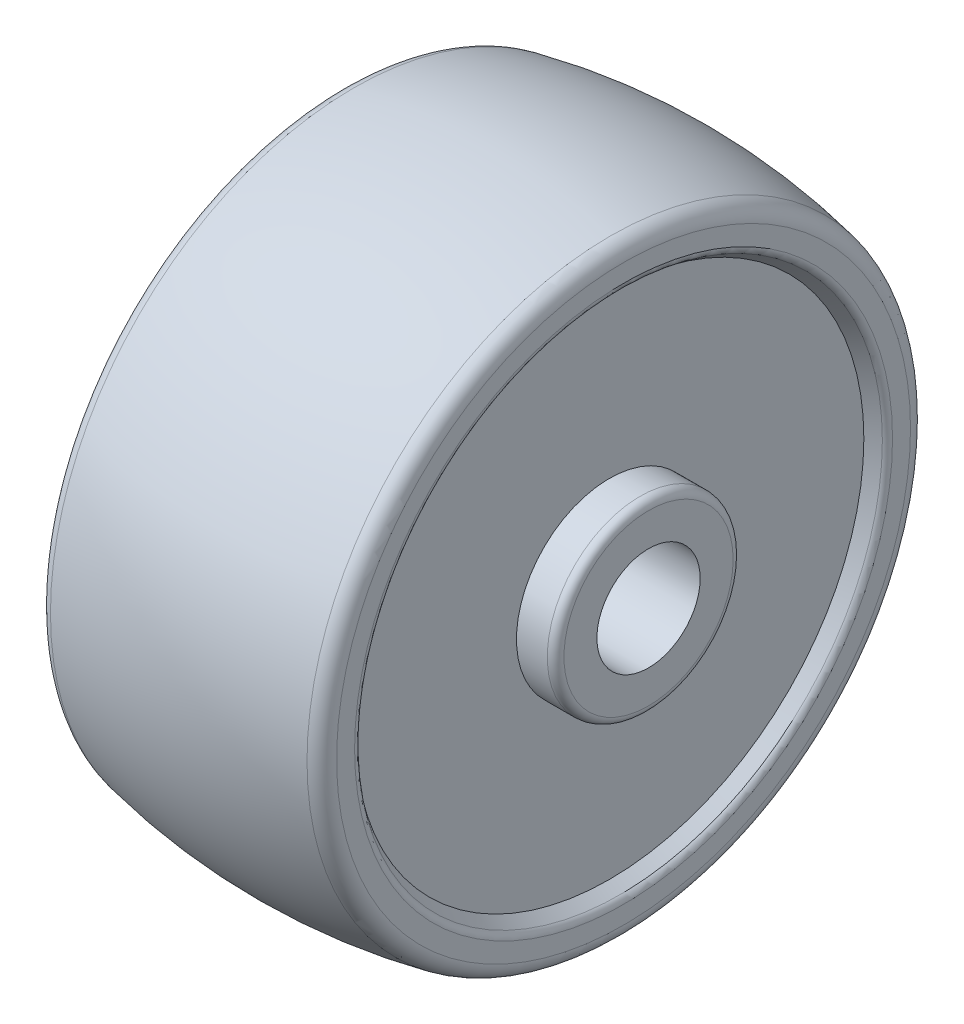
ISO-10303-21;
HEADER;
FILE_DESCRIPTION(('STEP AP214'),'2;1');
FILE_NAME('part.step','',(''),(''),'','','');
FILE_SCHEMA(('AUTOMOTIVE_DESIGN { 1 0 10303 214 1 1 1 1 }'));
ENDSEC;
DATA;
#1=APPLICATION_CONTEXT('core data for automotive mechanical design processes');
#2=APPLICATION_PROTOCOL_DEFINITION('international standard','automotive_design',2000,#1);
#3=PRODUCT_CONTEXT('',#1,'mechanical');
#4=PRODUCT('Part','Part','',(#3));
#5=PRODUCT_RELATED_PRODUCT_CATEGORY('part','',(#4));
#6=PRODUCT_DEFINITION_FORMATION('','',#4);
#7=PRODUCT_DEFINITION_CONTEXT('part definition',#1,'design');
#8=PRODUCT_DEFINITION('design','',#6,#7);
#9=PRODUCT_DEFINITION_SHAPE('','',#8);
#10=(LENGTH_UNIT() NAMED_UNIT(*) SI_UNIT(.MILLI.,.METRE.));
#11=(NAMED_UNIT(*) PLANE_ANGLE_UNIT() SI_UNIT($,.RADIAN.));
#12=(NAMED_UNIT(*) SI_UNIT($,.STERADIAN.) SOLID_ANGLE_UNIT());
#13=UNCERTAINTY_MEASURE_WITH_UNIT(LENGTH_MEASURE(1.E-05),#10,'distance_accuracy_value','');
#14=(GEOMETRIC_REPRESENTATION_CONTEXT(3) GLOBAL_UNCERTAINTY_ASSIGNED_CONTEXT((#13)) GLOBAL_UNIT_ASSIGNED_CONTEXT((#10,
#11,#12)) REPRESENTATION_CONTEXT('',''));
#15=CARTESIAN_POINT('',(0.,0.,0.));
#16=DIRECTION('',(0.,0.,1.));
#17=DIRECTION('',(1.,0.,0.));
#18=AXIS2_PLACEMENT_3D('',#15,#16,#17);
#19=CARTESIAN_POINT('',(-9.5,0.,0.));
#20=DIRECTION('',(1.,0.,0.));
#21=DIRECTION('',(0.,0.,-1.));
#22=AXIS2_PLACEMENT_3D('',#19,#20,#21);
#23=TOROIDAL_SURFACE('',#22,5.08000000000009,0.499999999999912);
#24=CARTESIAN_POINT('',(-10.,0.,0.));
#25=DIRECTION('',(1.,0.,0.));
#26=DIRECTION('',(0.,0.,-1.));
#27=AXIS2_PLACEMENT_3D('',#24,#25,#26);
#28=CIRCLE('',#27,5.08000000000009);
#29=CARTESIAN_POINT('',(-10.,0.,-5.08000000000009));
#30=VERTEX_POINT('',#29);
#31=EDGE_CURVE('E73',#30,#30,#28,.T.);
#32=ORIENTED_EDGE('',*,*,#31,.T.);
#33=EDGE_LOOP('',(#32));
#34=FACE_BOUND('',#33,.T.);
#35=CARTESIAN_POINT('',(-9.5,0.,0.));
#36=DIRECTION('',(1.,0.,0.));
#37=DIRECTION('',(0.,0.,-1.));
#38=AXIS2_PLACEMENT_3D('',#35,#36,#37);
#39=CIRCLE('',#38,5.58);
#40=CARTESIAN_POINT('',(-9.5,0.,-5.58));
#41=VERTEX_POINT('',#40);
#42=EDGE_CURVE('E70',#41,#41,#39,.T.);
#43=ORIENTED_EDGE('',*,*,#42,.F.);
#44=EDGE_LOOP('',(#43));
#45=FACE_BOUND('',#44,.T.);
#46=ADVANCED_FACE('F14',(#34,#45),#23,.T.);
#47=CARTESIAN_POINT('',(-10.,5.08,0.));
#48=DIRECTION('',(-1.,0.,0.));
#49=DIRECTION('',(0.,0.,1.));
#50=AXIS2_PLACEMENT_3D('',#47,#48,#49);
#51=PLANE('',#50);
#52=CARTESIAN_POINT('',(-10.,0.,0.));
#53=DIRECTION('',(1.,0.,0.));
#54=DIRECTION('',(0.,0.,-1.));
#55=AXIS2_PLACEMENT_3D('',#52,#53,#54);
#56=CIRCLE('',#55,3.1);
#57=CARTESIAN_POINT('',(-10.,0.,-3.1));
#58=VERTEX_POINT('',#57);
#59=EDGE_CURVE('E67',#58,#58,#56,.T.);
#60=ORIENTED_EDGE('',*,*,#59,.T.);
#61=EDGE_LOOP('',(#60));
#62=FACE_BOUND('',#61,.T.);
#63=ORIENTED_EDGE('',*,*,#31,.F.);
#64=EDGE_LOOP('',(#63));
#65=FACE_BOUND('',#64,.T.);
#66=ADVANCED_FACE('F79',(#62,#65),#51,.T.);
#67=CARTESIAN_POINT('',(10.,0.,0.));
#68=DIRECTION('',(1.,0.,0.));
#69=DIRECTION('',(0.,0.,-1.));
#70=AXIS2_PLACEMENT_3D('',#67,#68,#69);
#71=CYLINDRICAL_SURFACE('',#70,5.58);
#72=ORIENTED_EDGE('',*,*,#42,.T.);
#73=EDGE_LOOP('',(#72));
#74=FACE_BOUND('',#73,.T.);
#75=CARTESIAN_POINT('',(-7.65,0.,0.));
#76=DIRECTION('',(1.,0.,0.));
#77=DIRECTION('',(0.,0.,-1.));
#78=AXIS2_PLACEMENT_3D('',#75,#76,#77);
#79=CIRCLE('',#78,5.58);
#80=CARTESIAN_POINT('',(-7.65,0.,-5.58));
#81=VERTEX_POINT('',#80);
#82=EDGE_CURVE('E64',#81,#81,#79,.T.);
#83=ORIENTED_EDGE('',*,*,#82,.F.);
#84=EDGE_LOOP('',(#83));
#85=FACE_BOUND('',#84,.T.);
#86=ADVANCED_FACE('F81',(#74,#85),#71,.T.);
#87=CARTESIAN_POINT('',(10.,0.,0.));
#88=DIRECTION('',(1.,0.,0.));
#89=DIRECTION('',(0.,0.,-1.));
#90=AXIS2_PLACEMENT_3D('',#87,#88,#89);
#91=CYLINDRICAL_SURFACE('',#90,3.1);
#92=CARTESIAN_POINT('',(10.,0.,0.));
#93=DIRECTION('',(1.,0.,0.));
#94=DIRECTION('',(0.,0.,-1.));
#95=AXIS2_PLACEMENT_3D('',#92,#93,#94);
#96=CIRCLE('',#95,3.1);
#97=CARTESIAN_POINT('',(10.,0.,-3.1));
#98=VERTEX_POINT('',#97);
#99=EDGE_CURVE('E61',#98,#98,#96,.T.);
#100=ORIENTED_EDGE('',*,*,#99,.T.);
#101=EDGE_LOOP('',(#100));
#102=FACE_BOUND('',#101,.T.);
#103=ORIENTED_EDGE('',*,*,#59,.F.);
#104=EDGE_LOOP('',(#103));
#105=FACE_BOUND('',#104,.T.);
#106=ADVANCED_FACE('F89',(#102,#105),#91,.F.);
#107=CARTESIAN_POINT('',(-7.65,15.28,0.));
#108=DIRECTION('',(-1.,0.,0.));
#109=DIRECTION('',(0.,0.,1.));
#110=AXIS2_PLACEMENT_3D('',#107,#108,#109);
#111=PLANE('',#110);
#112=ORIENTED_EDGE('',*,*,#82,.T.);
#113=EDGE_LOOP('',(#112));
#114=FACE_BOUND('',#113,.T.);
#115=CARTESIAN_POINT('',(-7.65,0.,0.));
#116=DIRECTION('',(1.,0.,0.));
#117=DIRECTION('',(0.,0.,-1.));
#118=AXIS2_PLACEMENT_3D('',#115,#116,#117);
#119=CIRCLE('',#118,15.28);
#120=CARTESIAN_POINT('',(-7.65,0.,-15.28));
#121=VERTEX_POINT('',#120);
#122=EDGE_CURVE('E58',#121,#121,#119,.T.);
#123=ORIENTED_EDGE('',*,*,#122,.F.);
#124=EDGE_LOOP('',(#123));
#125=FACE_BOUND('',#124,.T.);
#126=ADVANCED_FACE('F96',(#114,#125),#111,.T.);
#127=CARTESIAN_POINT('',(10.,3.1,0.));
#128=DIRECTION('',(1.,0.,0.));
#129=DIRECTION('',(0.,0.,-1.));
#130=AXIS2_PLACEMENT_3D('',#127,#128,#129);
#131=PLANE('',#130);
#132=CARTESIAN_POINT('',(10.,0.,0.));
#133=DIRECTION('',(1.,0.,0.));
#134=DIRECTION('',(0.,0.,-1.));
#135=AXIS2_PLACEMENT_3D('',#132,#133,#134);
#136=CIRCLE('',#135,5.08000000000009);
#137=CARTESIAN_POINT('',(10.,0.,-5.08000000000009));
#138=VERTEX_POINT('',#137);
#139=EDGE_CURVE('E55',#138,#138,#136,.T.);
#140=ORIENTED_EDGE('',*,*,#139,.T.);
#141=EDGE_LOOP('',(#140));
#142=FACE_BOUND('',#141,.T.);
#143=ORIENTED_EDGE('',*,*,#99,.F.);
#144=EDGE_LOOP('',(#143));
#145=FACE_BOUND('',#144,.T.);
#146=ADVANCED_FACE('F100',(#142,#145),#131,.T.);
#147=CARTESIAN_POINT('',(-8.2938926261462,0.,0.));
#148=DIRECTION('',(-1.,0.,0.));
#149=DIRECTION('',(0.,0.,1.));
#150=AXIS2_PLACEMENT_3D('',#147,#148,#149);
#151=CONICAL_SURFACE('',#150,15.747815376364,0.628318530717684);
#152=ORIENTED_EDGE('',*,*,#122,.T.);
#153=EDGE_LOOP('',(#152));
#154=FACE_BOUND('',#153,.T.);
#155=CARTESIAN_POINT('',(-8.2938926261462,0.,0.));
#156=DIRECTION('',(1.,0.,0.));
#157=DIRECTION('',(0.,0.,-1.));
#158=AXIS2_PLACEMENT_3D('',#155,#156,#157);
#159=CIRCLE('',#158,15.747815376364);
#160=CARTESIAN_POINT('',(-8.2938926261462,0.,-15.747815376364));
#161=VERTEX_POINT('',#160);
#162=EDGE_CURVE('E52',#161,#161,#159,.T.);
#163=ORIENTED_EDGE('',*,*,#162,.F.);
#164=EDGE_LOOP('',(#163));
#165=FACE_BOUND('',#164,.T.);
#166=ADVANCED_FACE('F104',(#154,#165),#151,.F.);
#167=CARTESIAN_POINT('',(9.5,0.,0.));
#168=DIRECTION('',(1.,0.,0.));
#169=DIRECTION('',(0.,0.,-1.));
#170=AXIS2_PLACEMENT_3D('',#167,#168,#169);
#171=TOROIDAL_SURFACE('',#170,5.08000000000009,0.499999999999912);
#172=CARTESIAN_POINT('',(9.5,0.,0.));
#173=DIRECTION('',(1.,0.,0.));
#174=DIRECTION('',(0.,0.,-1.));
#175=AXIS2_PLACEMENT_3D('',#172,#173,#174);
#176=CIRCLE('',#175,5.58);
#177=CARTESIAN_POINT('',(9.5,0.,-5.58));
#178=VERTEX_POINT('',#177);
#179=EDGE_CURVE('E49',#178,#178,#176,.T.);
#180=ORIENTED_EDGE('',*,*,#179,.T.);
#181=EDGE_LOOP('',(#180));
#182=FACE_BOUND('',#181,.T.);
#183=ORIENTED_EDGE('',*,*,#139,.F.);
#184=EDGE_LOOP('',(#183));
#185=FACE_BOUND('',#184,.T.);
#186=ADVANCED_FACE('F108',(#182,#185),#171,.T.);
#187=CARTESIAN_POINT('',(-7.9999999999991,0.,0.));
#188=DIRECTION('',(1.,0.,0.));
#189=DIRECTION('',(0.,0.,-1.));
#190=AXIS2_PLACEMENT_3D('',#187,#188,#189);
#191=TOROIDAL_SURFACE('',#190,16.1523238735519,0.500000000000899);
#192=ORIENTED_EDGE('',*,*,#162,.T.);
#193=EDGE_LOOP('',(#192));
#194=FACE_BOUND('',#193,.T.);
#195=CARTESIAN_POINT('',(-8.5,0.,0.));
#196=DIRECTION('',(1.,0.,0.));
#197=DIRECTION('',(0.,0.,-1.));
#198=AXIS2_PLACEMENT_3D('',#195,#196,#197);
#199=CIRCLE('',#198,16.1523238735519);
#200=CARTESIAN_POINT('',(-8.5,0.,-16.1523238735519));
#201=VERTEX_POINT('',#200);
#202=EDGE_CURVE('E46',#201,#201,#199,.T.);
#203=ORIENTED_EDGE('',*,*,#202,.F.);
#204=EDGE_LOOP('',(#203));
#205=FACE_BOUND('',#204,.T.);
#206=ADVANCED_FACE('F112',(#194,#205),#191,.T.);
#207=CARTESIAN_POINT('',(10.,0.,0.));
#208=DIRECTION('',(1.,0.,0.));
#209=DIRECTION('',(0.,0.,-1.));
#210=AXIS2_PLACEMENT_3D('',#207,#208,#209);
#211=CYLINDRICAL_SURFACE('',#210,5.58);
#212=CARTESIAN_POINT('',(7.65,0.,0.));
#213=DIRECTION('',(1.,0.,0.));
#214=DIRECTION('',(0.,0.,-1.));
#215=AXIS2_PLACEMENT_3D('',#212,#213,#214);
#216=CIRCLE('',#215,5.58);
#217=CARTESIAN_POINT('',(7.65,0.,-5.58));
#218=VERTEX_POINT('',#217);
#219=EDGE_CURVE('E43',#218,#218,#216,.T.);
#220=ORIENTED_EDGE('',*,*,#219,.T.);
#221=EDGE_LOOP('',(#220));
#222=FACE_BOUND('',#221,.T.);
#223=ORIENTED_EDGE('',*,*,#179,.F.);
#224=EDGE_LOOP('',(#223));
#225=FACE_BOUND('',#224,.T.);
#226=ADVANCED_FACE('F116',(#222,#225),#211,.T.);
#227=CARTESIAN_POINT('',(-8.5,17.231892028985,0.));
#228=DIRECTION('',(-1.,0.,0.));
#229=DIRECTION('',(0.,0.,1.));
#230=AXIS2_PLACEMENT_3D('',#227,#228,#229);
#231=PLANE('',#230);
#232=ORIENTED_EDGE('',*,*,#202,.T.);
#233=EDGE_LOOP('',(#232));
#234=FACE_BOUND('',#233,.T.);
#235=CARTESIAN_POINT('',(-8.5,0.,0.));
#236=DIRECTION('',(1.,0.,0.));
#237=DIRECTION('',(0.,0.,-1.));
#238=AXIS2_PLACEMENT_3D('',#235,#236,#237);
#239=CIRCLE('',#238,17.2318919408287);
#240=CARTESIAN_POINT('',(-8.5,0.,-17.2318919408287));
#241=VERTEX_POINT('',#240);
#242=EDGE_CURVE('E40',#241,#241,#239,.T.);
#243=ORIENTED_EDGE('',*,*,#242,.F.);
#244=EDGE_LOOP('',(#243));
#245=FACE_BOUND('',#244,.T.);
#246=ADVANCED_FACE('F120',(#234,#245),#231,.T.);
#247=CARTESIAN_POINT('',(7.65,5.58,0.));
#248=DIRECTION('',(1.,0.,0.));
#249=DIRECTION('',(0.,0.,-1.));
#250=AXIS2_PLACEMENT_3D('',#247,#248,#249);
#251=PLANE('',#250);
#252=CARTESIAN_POINT('',(7.65,0.,0.));
#253=DIRECTION('',(1.,0.,0.));
#254=DIRECTION('',(0.,0.,-1.));
#255=AXIS2_PLACEMENT_3D('',#252,#253,#254);
#256=CIRCLE('',#255,15.28);
#257=CARTESIAN_POINT('',(7.65,0.,-15.28));
#258=VERTEX_POINT('',#257);
#259=EDGE_CURVE('E37',#258,#258,#256,.T.);
#260=ORIENTED_EDGE('',*,*,#259,.T.);
#261=EDGE_LOOP('',(#260));
#262=FACE_BOUND('',#261,.T.);
#263=ORIENTED_EDGE('',*,*,#219,.F.);
#264=EDGE_LOOP('',(#263));
#265=FACE_BOUND('',#264,.T.);
#266=ADVANCED_FACE('F124',(#262,#265),#251,.T.);
#267=CARTESIAN_POINT('',(-7.50000000000109,0.,0.));
#268=DIRECTION('',(1.,0.,0.));
#269=DIRECTION('',(0.,0.,-1.));
#270=AXIS2_PLACEMENT_3D('',#267,#268,#269);
#271=TOROIDAL_SURFACE('',#270,17.2318920289852,0.999999999998914);
#272=ORIENTED_EDGE('',*,*,#242,.T.);
#273=EDGE_LOOP('',(#272));
#274=FACE_BOUND('',#273,.T.);
#275=CARTESIAN_POINT('',(-7.7027027027027,0.,0.));
#276=DIRECTION('',(1.,0.,0.));
#277=DIRECTION('',(0.,0.,-1.));
#278=AXIS2_PLACEMENT_3D('',#275,#276,#277);
#279=CIRCLE('',#278,18.211132354092);
#280=CARTESIAN_POINT('',(-7.7027027027027,0.,-18.211132354092));
#281=VERTEX_POINT('',#280);
#282=EDGE_CURVE('E34',#281,#281,#279,.T.);
#283=ORIENTED_EDGE('',*,*,#282,.F.);
#284=EDGE_LOOP('',(#283));
#285=FACE_BOUND('',#284,.T.);
#286=ADVANCED_FACE('F128',(#274,#285),#271,.T.);
#287=CARTESIAN_POINT('',(7.65,0.,0.));
#288=DIRECTION('',(1.,0.,0.));
#289=DIRECTION('',(0.,0.,-1.));
#290=AXIS2_PLACEMENT_3D('',#287,#288,#289);
#291=CONICAL_SURFACE('',#290,15.28,0.628318530717684);
#292=CARTESIAN_POINT('',(8.2938926261462,0.,0.));
#293=DIRECTION('',(1.,0.,0.));
#294=DIRECTION('',(0.,0.,-1.));
#295=AXIS2_PLACEMENT_3D('',#292,#293,#294);
#296=CIRCLE('',#295,15.747815376364);
#297=CARTESIAN_POINT('',(8.2938926261462,0.,-15.747815376364));
#298=VERTEX_POINT('',#297);
#299=EDGE_CURVE('E29',#298,#298,#296,.T.);
#300=ORIENTED_EDGE('',*,*,#299,.T.);
#301=EDGE_LOOP('',(#300));
#302=FACE_BOUND('',#301,.T.);
#303=ORIENTED_EDGE('',*,*,#259,.F.);
#304=EDGE_LOOP('',(#303));
#305=FACE_BOUND('',#304,.T.);
#306=ADVANCED_FACE('F132',(#302,#305),#291,.F.);
#307=CARTESIAN_POINT('',(0.,0.,0.));
#308=DIRECTION('',(1.,0.,0.));
#309=DIRECTION('',(0.,0.,-1.));
#310=AXIS2_PLACEMENT_3D('',#307,#308,#309);
#311=DEGENERATE_TOROIDAL_SURFACE('',#310,18.9999999999848,37.9999999999848,.F.);
#312=ORIENTED_EDGE('',*,*,#282,.T.);
#313=EDGE_LOOP('',(#312));
#314=FACE_BOUND('',#313,.T.);
#315=CARTESIAN_POINT('',(7.7027027027027,0.,0.));
#316=DIRECTION('',(1.,0.,0.));
#317=DIRECTION('',(0.,0.,-1.));
#318=AXIS2_PLACEMENT_3D('',#315,#316,#317);
#319=CIRCLE('',#318,18.211132354092);
#320=CARTESIAN_POINT('',(7.7027027027027,0.,-18.211132354092));
#321=VERTEX_POINT('',#320);
#322=EDGE_CURVE('E25',#321,#321,#319,.T.);
#323=ORIENTED_EDGE('',*,*,#322,.F.);
#324=EDGE_LOOP('',(#323));
#325=FACE_BOUND('',#324,.T.);
#326=ADVANCED_FACE('F136',(#314,#325),#311,.F.);
#327=CARTESIAN_POINT('',(7.9999999999991,0.,0.));
#328=DIRECTION('',(1.,0.,0.));
#329=DIRECTION('',(0.,0.,-1.));
#330=AXIS2_PLACEMENT_3D('',#327,#328,#329);
#331=TOROIDAL_SURFACE('',#330,16.1523238735519,0.500000000000899);
#332=CARTESIAN_POINT('',(8.5,0.,0.));
#333=DIRECTION('',(1.,0.,0.));
#334=DIRECTION('',(0.,0.,-1.));
#335=AXIS2_PLACEMENT_3D('',#332,#333,#334);
#336=CIRCLE('',#335,16.1523238735519);
#337=CARTESIAN_POINT('',(8.5,0.,-16.1523238735519));
#338=VERTEX_POINT('',#337);
#339=EDGE_CURVE('E21',#338,#338,#336,.T.);
#340=ORIENTED_EDGE('',*,*,#339,.T.);
#341=EDGE_LOOP('',(#340));
#342=FACE_BOUND('',#341,.T.);
#343=ORIENTED_EDGE('',*,*,#299,.F.);
#344=EDGE_LOOP('',(#343));
#345=FACE_BOUND('',#344,.T.);
#346=ADVANCED_FACE('F140',(#342,#345),#331,.T.);
#347=CARTESIAN_POINT('',(7.50000000000109,0.,0.));
#348=DIRECTION('',(1.,0.,0.));
#349=DIRECTION('',(0.,0.,-1.));
#350=AXIS2_PLACEMENT_3D('',#347,#348,#349);
#351=TOROIDAL_SURFACE('',#350,17.2318920289852,0.999999999998913);
#352=ORIENTED_EDGE('',*,*,#322,.T.);
#353=EDGE_LOOP('',(#352));
#354=FACE_BOUND('',#353,.T.);
#355=CARTESIAN_POINT('',(8.5,0.,0.));
#356=DIRECTION('',(1.,0.,0.));
#357=DIRECTION('',(0.,0.,-1.));
#358=AXIS2_PLACEMENT_3D('',#355,#356,#357);
#359=CIRCLE('',#358,17.2318919544794);
#360=CARTESIAN_POINT('',(8.5,0.,-17.2318919544794));
#361=VERTEX_POINT('',#360);
#362=EDGE_CURVE('E9',#361,#361,#359,.T.);
#363=ORIENTED_EDGE('',*,*,#362,.F.);
#364=EDGE_LOOP('',(#363));
#365=FACE_BOUND('',#364,.T.);
#366=ADVANCED_FACE('F143',(#354,#365),#351,.T.);
#367=CARTESIAN_POINT('',(8.5,16.152323873552,0.));
#368=DIRECTION('',(1.,0.,0.));
#369=DIRECTION('',(0.,0.,-1.));
#370=AXIS2_PLACEMENT_3D('',#367,#368,#369);
#371=PLANE('',#370);
#372=ORIENTED_EDGE('',*,*,#362,.T.);
#373=EDGE_LOOP('',(#372));
#374=FACE_BOUND('',#373,.T.);
#375=ORIENTED_EDGE('',*,*,#339,.F.);
#376=EDGE_LOOP('',(#375));
#377=FACE_BOUND('',#376,.T.);
#378=ADVANCED_FACE('F16',(#374,#377),#371,.T.);
#379=CLOSED_SHELL('',(#46,#66,#86,#106,#126,#146,#166,#186,#206,#226,#246,#266,#286,#306,#326,
#346,#366,#378));
#380=MANIFOLD_SOLID_BREP('B1',#379);
#381=ADVANCED_BREP_SHAPE_REPRESENTATION('',(#18,#380),#14);
#382=SHAPE_DEFINITION_REPRESENTATION(#9,#381);
ENDSEC;
END-ISO-10303-21;
